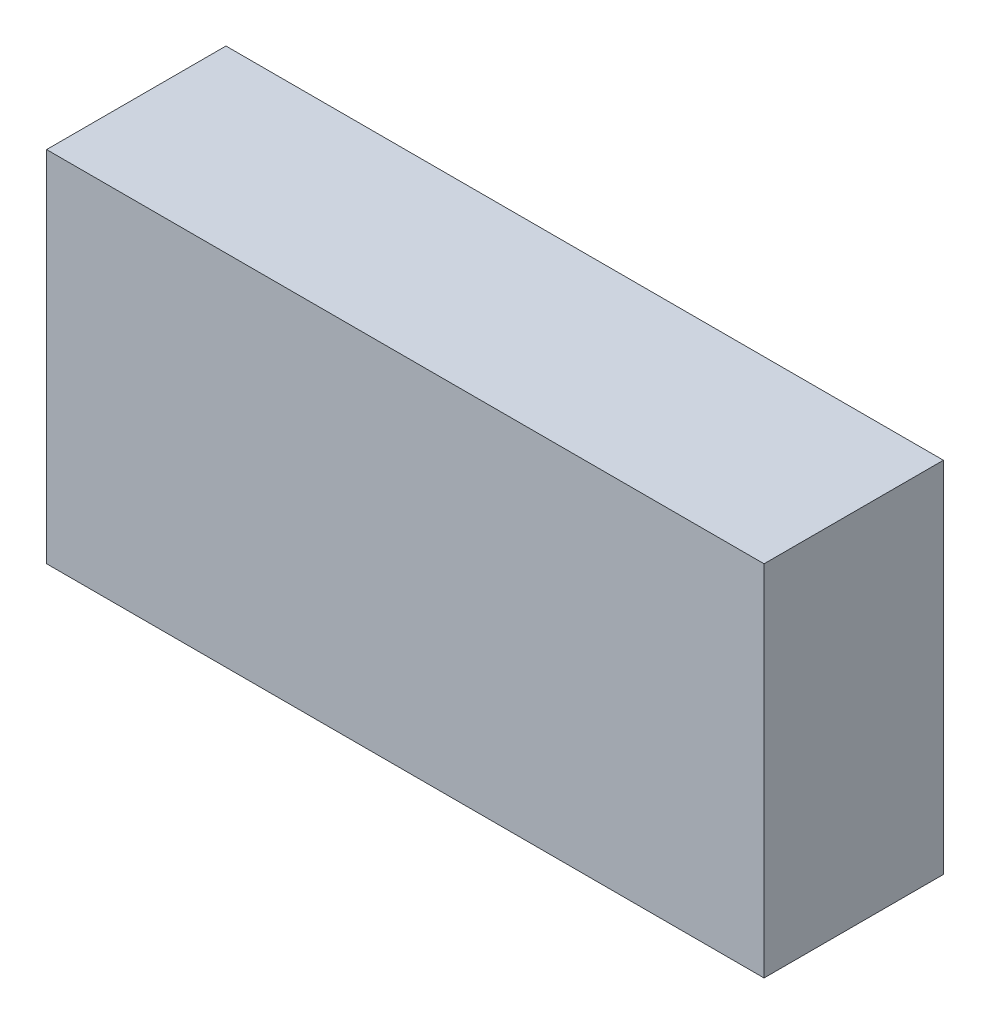
ISO-10303-21;
HEADER;
FILE_DESCRIPTION(('STEP AP214'),'2;1');
FILE_NAME('part.step','',(''),(''),'','','');
FILE_SCHEMA(('AUTOMOTIVE_DESIGN { 1 0 10303 214 1 1 1 1 }'));
ENDSEC;
DATA;
#1=APPLICATION_CONTEXT('core data for automotive mechanical design processes');
#2=APPLICATION_PROTOCOL_DEFINITION('international standard','automotive_design',2000,#1);
#3=PRODUCT_CONTEXT('',#1,'mechanical');
#4=PRODUCT('Part','Part','',(#3));
#5=PRODUCT_RELATED_PRODUCT_CATEGORY('part','',(#4));
#6=PRODUCT_DEFINITION_FORMATION('','',#4);
#7=PRODUCT_DEFINITION_CONTEXT('part definition',#1,'design');
#8=PRODUCT_DEFINITION('design','',#6,#7);
#9=PRODUCT_DEFINITION_SHAPE('','',#8);
#10=(LENGTH_UNIT() NAMED_UNIT(*) SI_UNIT(.MILLI.,.METRE.));
#11=(NAMED_UNIT(*) PLANE_ANGLE_UNIT() SI_UNIT($,.RADIAN.));
#12=(NAMED_UNIT(*) SI_UNIT($,.STERADIAN.) SOLID_ANGLE_UNIT());
#13=UNCERTAINTY_MEASURE_WITH_UNIT(LENGTH_MEASURE(1.E-05),#10,'distance_accuracy_value','');
#14=(GEOMETRIC_REPRESENTATION_CONTEXT(3) GLOBAL_UNCERTAINTY_ASSIGNED_CONTEXT((#13)) GLOBAL_UNIT_ASSIGNED_CONTEXT((#10,
#11,#12)) REPRESENTATION_CONTEXT('',''));
#15=CARTESIAN_POINT('',(0.,0.,0.));
#16=DIRECTION('',(0.,0.,1.));
#17=DIRECTION('',(1.,0.,0.));
#18=AXIS2_PLACEMENT_3D('',#15,#16,#17);
#19=CARTESIAN_POINT('',(-0.799998399999991,-0.399999200000001,0.3999992));
#20=DIRECTION('',(1.,0.,0.));
#21=DIRECTION('',(0.,1.,0.));
#22=AXIS2_PLACEMENT_3D('',#19,#20,#21);
#23=PLANE('',#22);
#24=DIRECTION('',(0.,-1.,0.));
#25=VECTOR('',#24,1.);
#26=CARTESIAN_POINT('',(-0.799998399999991,-0.399999200000001,0.));
#27=LINE('',#26,#25);
#28=CARTESIAN_POINT('',(-0.79999839999999,0.399999200000001,0.));
#29=VERTEX_POINT('',#28);
#30=CARTESIAN_POINT('',(-0.799998399999991,-0.399999200000001,0.));
#31=VERTEX_POINT('',#30);
#32=EDGE_CURVE('E95',#29,#31,#27,.T.);
#33=ORIENTED_EDGE('',*,*,#32,.T.);
#34=DIRECTION('',(0.,0.,-1.));
#35=VECTOR('',#34,1.);
#36=CARTESIAN_POINT('',(-0.799998399999991,-0.399999200000001,0.3999992));
#37=LINE('',#36,#35);
#38=CARTESIAN_POINT('',(-0.799998399999991,-0.399999200000001,0.3999992));
#39=VERTEX_POINT('',#38);
#40=EDGE_CURVE('E11',#39,#31,#37,.T.);
#41=ORIENTED_EDGE('',*,*,#40,.F.);
#42=DIRECTION('',(0.,-1.,0.));
#43=VECTOR('',#42,1.);
#44=CARTESIAN_POINT('',(-0.799998399999991,-0.399999200000001,0.3999992));
#45=LINE('',#44,#43);
#46=CARTESIAN_POINT('',(-0.79999839999999,0.399999200000001,0.3999992));
#47=VERTEX_POINT('',#46);
#48=EDGE_CURVE('E83',#47,#39,#45,.T.);
#49=ORIENTED_EDGE('',*,*,#48,.F.);
#50=DIRECTION('',(0.,0.,-1.));
#51=VECTOR('',#50,1.);
#52=CARTESIAN_POINT('',(-0.79999839999999,0.399999200000001,0.3999992));
#53=LINE('',#52,#51);
#54=EDGE_CURVE('E91',#47,#29,#53,.T.);
#55=ORIENTED_EDGE('',*,*,#54,.T.);
#56=EDGE_LOOP('',(#33,#41,#49,#55));
#57=FACE_BOUND('',#56,.T.);
#58=ADVANCED_FACE('F32',(#57),#23,.F.);
#59=CARTESIAN_POINT('',(0.800023800000008,-0.399999200000002,0.3999992));
#60=DIRECTION('',(0.,1.,0.));
#61=DIRECTION('',(-1.,0.,0.));
#62=AXIS2_PLACEMENT_3D('',#59,#60,#61);
#63=PLANE('',#62);
#64=DIRECTION('',(1.,0.,0.));
#65=VECTOR('',#64,1.);
#66=CARTESIAN_POINT('',(0.800023800000008,-0.399999200000002,0.));
#67=LINE('',#66,#65);
#68=CARTESIAN_POINT('',(0.800023800000008,-0.399999200000002,0.));
#69=VERTEX_POINT('',#68);
#70=EDGE_CURVE('E87',#31,#69,#67,.T.);
#71=ORIENTED_EDGE('',*,*,#70,.T.);
#72=DIRECTION('',(0.,0.,-1.));
#73=VECTOR('',#72,1.);
#74=CARTESIAN_POINT('',(0.800023800000008,-0.399999200000002,0.3999992));
#75=LINE('',#74,#73);
#76=CARTESIAN_POINT('',(0.800023800000008,-0.399999200000002,0.3999992));
#77=VERTEX_POINT('',#76);
#78=EDGE_CURVE('E40',#77,#69,#75,.T.);
#79=ORIENTED_EDGE('',*,*,#78,.F.);
#80=DIRECTION('',(1.,0.,0.));
#81=VECTOR('',#80,1.);
#82=CARTESIAN_POINT('',(0.800023800000008,-0.399999200000002,0.3999992));
#83=LINE('',#82,#81);
#84=EDGE_CURVE('E78',#39,#77,#83,.T.);
#85=ORIENTED_EDGE('',*,*,#84,.F.);
#86=ORIENTED_EDGE('',*,*,#40,.T.);
#87=EDGE_LOOP('',(#71,#79,#85,#86));
#88=FACE_BOUND('',#87,.T.);
#89=ADVANCED_FACE('F86',(#88),#63,.F.);
#90=CARTESIAN_POINT('',(0.800023800000007,0.399999200000001,0.3999992));
#91=DIRECTION('',(-1.,0.,0.));
#92=DIRECTION('',(0.,-1.,0.));
#93=AXIS2_PLACEMENT_3D('',#90,#91,#92);
#94=PLANE('',#93);
#95=DIRECTION('',(0.,1.,0.));
#96=VECTOR('',#95,1.);
#97=CARTESIAN_POINT('',(0.800023800000007,0.399999200000001,0.));
#98=LINE('',#97,#96);
#99=CARTESIAN_POINT('',(0.800023800000007,0.399999200000001,0.));
#100=VERTEX_POINT('',#99);
#101=EDGE_CURVE('E65',#69,#100,#98,.T.);
#102=ORIENTED_EDGE('',*,*,#101,.T.);
#103=DIRECTION('',(0.,0.,-1.));
#104=VECTOR('',#103,1.);
#105=CARTESIAN_POINT('',(0.800023800000007,0.399999200000001,0.3999992));
#106=LINE('',#105,#104);
#107=CARTESIAN_POINT('',(0.800023800000007,0.399999200000001,0.3999992));
#108=VERTEX_POINT('',#107);
#109=EDGE_CURVE('E88',#108,#100,#106,.T.);
#110=ORIENTED_EDGE('',*,*,#109,.F.);
#111=DIRECTION('',(0.,1.,0.));
#112=VECTOR('',#111,1.);
#113=CARTESIAN_POINT('',(0.800023800000007,0.399999200000001,0.3999992));
#114=LINE('',#113,#112);
#115=EDGE_CURVE('E81',#77,#108,#114,.T.);
#116=ORIENTED_EDGE('',*,*,#115,.F.);
#117=ORIENTED_EDGE('',*,*,#78,.T.);
#118=EDGE_LOOP('',(#102,#110,#116,#117));
#119=FACE_BOUND('',#118,.T.);
#120=ADVANCED_FACE('F89',(#119),#94,.F.);
#121=CARTESIAN_POINT('',(-0.79999839999999,0.399999200000001,0.3999992));
#122=DIRECTION('',(0.,-1.,0.));
#123=DIRECTION('',(0.,0.,-1.));
#124=AXIS2_PLACEMENT_3D('',#121,#122,#123);
#125=PLANE('',#124);
#126=DIRECTION('',(-1.,0.,0.));
#127=VECTOR('',#126,1.);
#128=CARTESIAN_POINT('',(-0.79999839999999,0.399999200000001,0.));
#129=LINE('',#128,#127);
#130=EDGE_CURVE('E71',#100,#29,#129,.T.);
#131=ORIENTED_EDGE('',*,*,#130,.T.);
#132=ORIENTED_EDGE('',*,*,#54,.F.);
#133=DIRECTION('',(-1.,0.,0.));
#134=VECTOR('',#133,1.);
#135=CARTESIAN_POINT('',(-0.79999839999999,0.399999200000001,0.3999992));
#136=LINE('',#135,#134);
#137=EDGE_CURVE('E48',#108,#47,#136,.T.);
#138=ORIENTED_EDGE('',*,*,#137,.F.);
#139=ORIENTED_EDGE('',*,*,#109,.T.);
#140=EDGE_LOOP('',(#131,#132,#138,#139));
#141=FACE_BOUND('',#140,.T.);
#142=ADVANCED_FACE('F102',(#141),#125,.F.);
#143=CARTESIAN_POINT('',(0.,0.,0.3999992));
#144=DIRECTION('',(0.,0.,-1.));
#145=DIRECTION('',(-1.,0.,0.));
#146=AXIS2_PLACEMENT_3D('',#143,#144,#145);
#147=PLANE('',#146);
#148=ORIENTED_EDGE('',*,*,#48,.T.);
#149=ORIENTED_EDGE('',*,*,#84,.T.);
#150=ORIENTED_EDGE('',*,*,#115,.T.);
#151=ORIENTED_EDGE('',*,*,#137,.T.);
#152=EDGE_LOOP('',(#148,#149,#150,#151));
#153=FACE_BOUND('',#152,.T.);
#154=ADVANCED_FACE('F79',(#153),#147,.F.);
#155=CARTESIAN_POINT('',(0.,0.,0.));
#156=DIRECTION('',(0.,0.,-1.));
#157=DIRECTION('',(-1.,0.,0.));
#158=AXIS2_PLACEMENT_3D('',#155,#156,#157);
#159=PLANE('',#158);
#160=ORIENTED_EDGE('',*,*,#32,.F.);
#161=ORIENTED_EDGE('',*,*,#130,.F.);
#162=ORIENTED_EDGE('',*,*,#101,.F.);
#163=ORIENTED_EDGE('',*,*,#70,.F.);
#164=EDGE_LOOP('',(#160,#161,#162,#163));
#165=FACE_BOUND('',#164,.T.);
#166=ADVANCED_FACE('F105',(#165),#159,.T.);
#167=CLOSED_SHELL('',(#58,#89,#120,#142,#154,#166));
#168=MANIFOLD_SOLID_BREP('B2',#167);
#169=ADVANCED_BREP_SHAPE_REPRESENTATION('',(#18,#168),#14);
#170=SHAPE_DEFINITION_REPRESENTATION(#9,#169);
ENDSEC;
END-ISO-10303-21;
